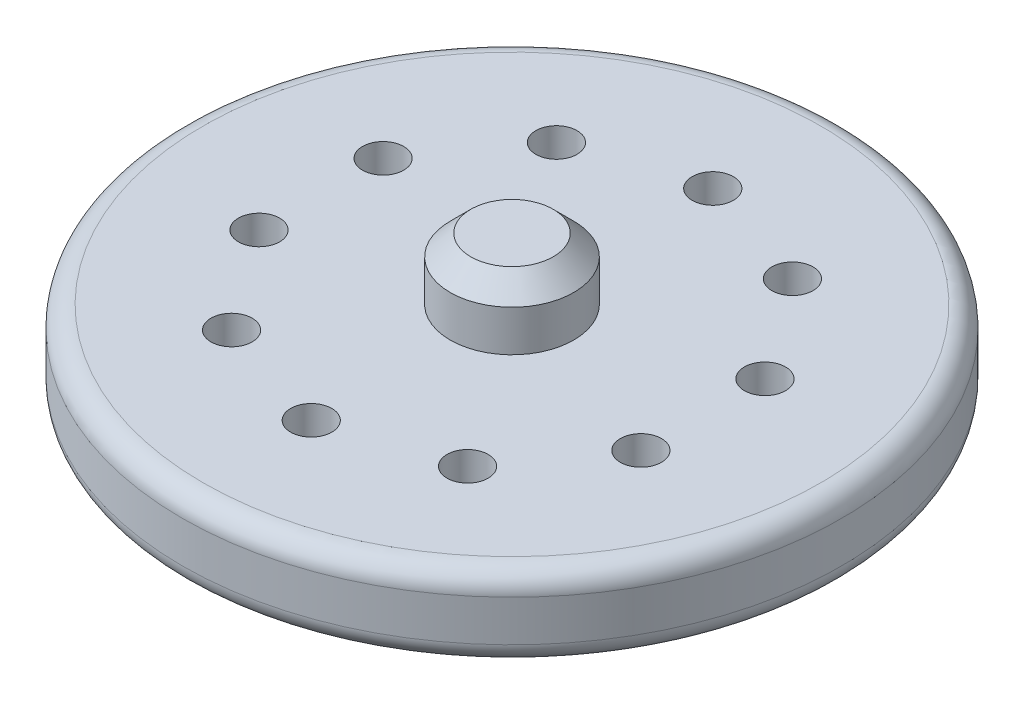
ISO-10303-21;
HEADER;
FILE_DESCRIPTION(('STEP AP214'),'2;1');
FILE_NAME('part.step','',(''),(''),'','','');
FILE_SCHEMA(('AUTOMOTIVE_DESIGN { 1 0 10303 214 1 1 1 1 }'));
ENDSEC;
DATA;
#1=APPLICATION_CONTEXT('core data for automotive mechanical design processes');
#2=APPLICATION_PROTOCOL_DEFINITION('international standard','automotive_design',2000,#1);
#3=PRODUCT_CONTEXT('',#1,'mechanical');
#4=PRODUCT('Part','Part','',(#3));
#5=PRODUCT_RELATED_PRODUCT_CATEGORY('part','',(#4));
#6=PRODUCT_DEFINITION_FORMATION('','',#4);
#7=PRODUCT_DEFINITION_CONTEXT('part definition',#1,'design');
#8=PRODUCT_DEFINITION('design','',#6,#7);
#9=PRODUCT_DEFINITION_SHAPE('','',#8);
#10=(LENGTH_UNIT() NAMED_UNIT(*) SI_UNIT(.MILLI.,.METRE.));
#11=(NAMED_UNIT(*) PLANE_ANGLE_UNIT() SI_UNIT($,.RADIAN.));
#12=(NAMED_UNIT(*) SI_UNIT($,.STERADIAN.) SOLID_ANGLE_UNIT());
#13=UNCERTAINTY_MEASURE_WITH_UNIT(LENGTH_MEASURE(1.E-05),#10,'distance_accuracy_value','');
#14=(GEOMETRIC_REPRESENTATION_CONTEXT(3) GLOBAL_UNCERTAINTY_ASSIGNED_CONTEXT((#13)) GLOBAL_UNIT_ASSIGNED_CONTEXT((#10,
#11,#12)) REPRESENTATION_CONTEXT('',''));
#15=CARTESIAN_POINT('',(0.,0.,0.));
#16=DIRECTION('',(0.,0.,1.));
#17=DIRECTION('',(1.,0.,0.));
#18=AXIS2_PLACEMENT_3D('',#15,#16,#17);
#19=CARTESIAN_POINT('',(-29.715512056726,20.,-28.3470345277978));
#20=DIRECTION('',(0.,-1.,0.));
#21=DIRECTION('',(0.,0.,-1.));
#22=AXIS2_PLACEMENT_3D('',#19,#20,#21);
#23=CYLINDRICAL_SURFACE('',#22,80.);
#24=CARTESIAN_POINT('',(-29.715512056726,5.,-28.3470345277978));
#25=DIRECTION('',(0.,1.,0.));
#26=DIRECTION('',(0.,0.,1.));
#27=AXIS2_PLACEMENT_3D('',#24,#25,#26);
#28=CIRCLE('',#27,80.);
#29=CARTESIAN_POINT('',(-29.715512056726,5.,51.6529654722022));
#30=VERTEX_POINT('',#29);
#31=EDGE_CURVE('E40',#30,#30,#28,.T.);
#32=ORIENTED_EDGE('',*,*,#31,.T.);
#33=EDGE_LOOP('',(#32));
#34=FACE_BOUND('',#33,.T.);
#35=CARTESIAN_POINT('',(-29.715512056726,15.,-28.3470345277978));
#36=DIRECTION('',(0.,1.,0.));
#37=DIRECTION('',(0.,0.,1.));
#38=AXIS2_PLACEMENT_3D('',#35,#36,#37);
#39=CIRCLE('',#38,80.);
#40=CARTESIAN_POINT('',(-29.715512056726,15.,51.6529654722022));
#41=VERTEX_POINT('',#40);
#42=EDGE_CURVE('E44',#41,#41,#39,.F.);
#43=ORIENTED_EDGE('',*,*,#42,.T.);
#44=EDGE_LOOP('',(#43));
#45=FACE_BOUND('',#44,.T.);
#46=ADVANCED_FACE('F33',(#34,#45),#23,.T.);
#47=CARTESIAN_POINT('',(-29.715512056726,20.,-28.3470345277978));
#48=DIRECTION('',(0.,1.,0.));
#49=DIRECTION('',(0.,0.,1.));
#50=AXIS2_PLACEMENT_3D('',#47,#48,#49);
#51=PLANE('',#50);
#52=CARTESIAN_POINT('',(-1.07025197123732,20.,-67.773852616659));
#53=DIRECTION('',(0.,1.,0.));
#54=DIRECTION('',(0.,0.,1.));
#55=AXIS2_PLACEMENT_3D('',#52,#53,#54);
#56=CIRCLE('',#55,5.);
#57=CARTESIAN_POINT('',(-1.07025197123732,20.,-62.773852616659));
#58=VERTEX_POINT('',#57);
#59=EDGE_CURVE('E112',#58,#58,#56,.T.);
#60=ORIENTED_EDGE('',*,*,#59,.F.);
#61=EDGE_LOOP('',(#60));
#62=FACE_BOUND('',#61,.T.);
#63=CARTESIAN_POINT('',(16.6334923781756,20.,-43.406738969484));
#64=DIRECTION('',(0.,1.,0.));
#65=DIRECTION('',(0.,0.,1.));
#66=AXIS2_PLACEMENT_3D('',#63,#64,#65);
#67=CIRCLE('',#66,5.);
#68=CARTESIAN_POINT('',(16.6334923781756,20.,-38.406738969484));
#69=VERTEX_POINT('',#68);
#70=EDGE_CURVE('E106',#69,#69,#67,.T.);
#71=ORIENTED_EDGE('',*,*,#70,.F.);
#72=EDGE_LOOP('',(#71));
#73=FACE_BOUND('',#72,.T.);
#74=CARTESIAN_POINT('',(16.6334923781759,20.,-13.2873300861126));
#75=DIRECTION('',(0.,1.,0.));
#76=DIRECTION('',(0.,0.,1.));
#77=AXIS2_PLACEMENT_3D('',#74,#75,#76);
#78=CIRCLE('',#77,5.);
#79=CARTESIAN_POINT('',(16.6334923781759,20.,-8.28733008611258));
#80=VERTEX_POINT('',#79);
#81=EDGE_CURVE('E100',#80,#80,#78,.T.);
#82=ORIENTED_EDGE('',*,*,#81,.F.);
#83=EDGE_LOOP('',(#82));
#84=FACE_BOUND('',#83,.T.);
#85=CARTESIAN_POINT('',(-1.0702519712365,20.,11.0797835610628));
#86=DIRECTION('',(0.,1.,0.));
#87=DIRECTION('',(0.,0.,1.));
#88=AXIS2_PLACEMENT_3D('',#85,#86,#87);
#89=CIRCLE('',#88,5.);
#90=CARTESIAN_POINT('',(-1.0702519712365,20.,16.0797835610628));
#91=VERTEX_POINT('',#90);
#92=EDGE_CURVE('E94',#91,#91,#89,.T.);
#93=ORIENTED_EDGE('',*,*,#92,.F.);
#94=EDGE_LOOP('',(#93));
#95=FACE_BOUND('',#94,.T.);
#96=CARTESIAN_POINT('',(-29.7155120567249,20.,20.3871927665525));
#97=DIRECTION('',(0.,1.,0.));
#98=DIRECTION('',(0.,0.,1.));
#99=AXIS2_PLACEMENT_3D('',#96,#97,#98);
#100=CIRCLE('',#99,5.00000000000001);
#101=CARTESIAN_POINT('',(-29.7155120567249,20.,25.3871927665525));
#102=VERTEX_POINT('',#101);
#103=EDGE_CURVE('E88',#102,#102,#100,.T.);
#104=ORIENTED_EDGE('',*,*,#103,.F.);
#105=EDGE_LOOP('',(#104));
#106=FACE_BOUND('',#105,.T.);
#107=CARTESIAN_POINT('',(-58.3607721422135,20.,11.0797835610632));
#108=DIRECTION('',(0.,1.,0.));
#109=DIRECTION('',(0.,0.,1.));
#110=AXIS2_PLACEMENT_3D('',#107,#108,#109);
#111=CIRCLE('',#110,5.00000000000001);
#112=CARTESIAN_POINT('',(-58.3607721422135,20.,16.0797835610632));
#113=VERTEX_POINT('',#112);
#114=EDGE_CURVE('E82',#113,#113,#111,.T.);
#115=ORIENTED_EDGE('',*,*,#114,.F.);
#116=EDGE_LOOP('',(#115));
#117=FACE_BOUND('',#116,.T.);
#118=CARTESIAN_POINT('',(-76.0645164916262,20.,-13.287330086112));
#119=DIRECTION('',(0.,1.,0.));
#120=DIRECTION('',(0.,0.,1.));
#121=AXIS2_PLACEMENT_3D('',#118,#119,#120);
#122=CIRCLE('',#121,5.);
#123=CARTESIAN_POINT('',(-76.0645164916262,20.,-8.28733008611195));
#124=VERTEX_POINT('',#123);
#125=EDGE_CURVE('E76',#124,#124,#122,.T.);
#126=ORIENTED_EDGE('',*,*,#125,.F.);
#127=EDGE_LOOP('',(#126));
#128=FACE_BOUND('',#127,.T.);
#129=CARTESIAN_POINT('',(-76.0645164916263,20.,-43.4067389694834));
#130=DIRECTION('',(0.,1.,0.));
#131=DIRECTION('',(0.,0.,1.));
#132=AXIS2_PLACEMENT_3D('',#129,#130,#131);
#133=CIRCLE('',#132,5.);
#134=CARTESIAN_POINT('',(-76.0645164916263,20.,-38.4067389694834));
#135=VERTEX_POINT('',#134);
#136=EDGE_CURVE('E69',#135,#135,#133,.T.);
#137=ORIENTED_EDGE('',*,*,#136,.F.);
#138=EDGE_LOOP('',(#137));
#139=FACE_BOUND('',#138,.T.);
#140=CARTESIAN_POINT('',(-58.3607721422138,20.,-67.7738526166586));
#141=DIRECTION('',(0.,1.,0.));
#142=DIRECTION('',(0.,0.,1.));
#143=AXIS2_PLACEMENT_3D('',#140,#141,#142);
#144=CIRCLE('',#143,5.);
#145=CARTESIAN_POINT('',(-58.3607721422138,20.,-62.7738526166586));
#146=VERTEX_POINT('',#145);
#147=EDGE_CURVE('E117',#146,#146,#144,.T.);
#148=ORIENTED_EDGE('',*,*,#147,.F.);
#149=EDGE_LOOP('',(#148));
#150=FACE_BOUND('',#149,.T.);
#151=CARTESIAN_POINT('',(-29.715512056726,20.,-77.0812618221482));
#152=DIRECTION('',(0.,1.,0.));
#153=DIRECTION('',(0.,0.,1.));
#154=AXIS2_PLACEMENT_3D('',#151,#152,#153);
#155=CIRCLE('',#154,5.);
#156=CARTESIAN_POINT('',(-29.715512056726,20.,-72.0812618221482));
#157=VERTEX_POINT('',#156);
#158=EDGE_CURVE('E63',#157,#157,#155,.T.);
#159=ORIENTED_EDGE('',*,*,#158,.F.);
#160=EDGE_LOOP('',(#159));
#161=FACE_BOUND('',#160,.T.);
#162=CARTESIAN_POINT('',(-29.715512056726,20.,-28.3470345277978));
#163=DIRECTION('',(0.,1.,0.));
#164=DIRECTION('',(0.,0.,1.));
#165=AXIS2_PLACEMENT_3D('',#162,#163,#164);
#166=CIRCLE('',#165,75.);
#167=CARTESIAN_POINT('',(-29.715512056726,20.,46.6529654722022));
#168=VERTEX_POINT('',#167);
#169=EDGE_CURVE('E48',#168,#168,#166,.T.);
#170=ORIENTED_EDGE('',*,*,#169,.T.);
#171=EDGE_LOOP('',(#170));
#172=FACE_BOUND('',#171,.T.);
#173=CARTESIAN_POINT('',(-29.715512056726,20.,-28.3470345277978));
#174=DIRECTION('',(0.,1.,0.));
#175=DIRECTION('',(0.,0.,1.));
#176=AXIS2_PLACEMENT_3D('',#173,#174,#175);
#177=CIRCLE('',#176,15.);
#178=CARTESIAN_POINT('',(-29.715512056726,20.,-13.3470345277978));
#179=VERTEX_POINT('',#178);
#180=EDGE_CURVE('E59',#179,#179,#177,.T.);
#181=ORIENTED_EDGE('',*,*,#180,.F.);
#182=EDGE_LOOP('',(#181));
#183=FACE_BOUND('',#182,.T.);
#184=ADVANCED_FACE('F134',(#62,#73,#84,#95,#106,#117,#128,#139,#150,#161,#172,#183),#51,.T.);
#185=CARTESIAN_POINT('',(-29.715512056726,0.,-28.3470345277978));
#186=DIRECTION('',(0.,1.,0.));
#187=DIRECTION('',(0.,0.,1.));
#188=AXIS2_PLACEMENT_3D('',#185,#186,#187);
#189=PLANE('',#188);
#190=CARTESIAN_POINT('',(-1.07025197123732,0.,-67.773852616659));
#191=DIRECTION('',(0.,1.,0.));
#192=DIRECTION('',(0.,0.,1.));
#193=AXIS2_PLACEMENT_3D('',#190,#191,#192);
#194=CIRCLE('',#193,5.);
#195=CARTESIAN_POINT('',(-1.07025197123732,0.,-62.773852616659));
#196=VERTEX_POINT('',#195);
#197=EDGE_CURVE('E66',#196,#196,#194,.T.);
#198=ORIENTED_EDGE('',*,*,#197,.T.);
#199=EDGE_LOOP('',(#198));
#200=FACE_BOUND('',#199,.T.);
#201=CARTESIAN_POINT('',(16.6334923781756,0.,-43.406738969484));
#202=DIRECTION('',(0.,1.,0.));
#203=DIRECTION('',(0.,0.,1.));
#204=AXIS2_PLACEMENT_3D('',#201,#202,#203);
#205=CIRCLE('',#204,5.);
#206=CARTESIAN_POINT('',(16.6334923781756,0.,-38.406738969484));
#207=VERTEX_POINT('',#206);
#208=EDGE_CURVE('E109',#207,#207,#205,.T.);
#209=ORIENTED_EDGE('',*,*,#208,.T.);
#210=EDGE_LOOP('',(#209));
#211=FACE_BOUND('',#210,.T.);
#212=CARTESIAN_POINT('',(16.6334923781759,0.,-13.2873300861126));
#213=DIRECTION('',(0.,1.,0.));
#214=DIRECTION('',(0.,0.,1.));
#215=AXIS2_PLACEMENT_3D('',#212,#213,#214);
#216=CIRCLE('',#215,5.);
#217=CARTESIAN_POINT('',(16.6334923781759,0.,-8.28733008611258));
#218=VERTEX_POINT('',#217);
#219=EDGE_CURVE('E103',#218,#218,#216,.T.);
#220=ORIENTED_EDGE('',*,*,#219,.T.);
#221=EDGE_LOOP('',(#220));
#222=FACE_BOUND('',#221,.T.);
#223=CARTESIAN_POINT('',(-1.0702519712365,0.,11.0797835610628));
#224=DIRECTION('',(0.,1.,0.));
#225=DIRECTION('',(0.,0.,1.));
#226=AXIS2_PLACEMENT_3D('',#223,#224,#225);
#227=CIRCLE('',#226,5.);
#228=CARTESIAN_POINT('',(-1.0702519712365,0.,16.0797835610628));
#229=VERTEX_POINT('',#228);
#230=EDGE_CURVE('E97',#229,#229,#227,.T.);
#231=ORIENTED_EDGE('',*,*,#230,.T.);
#232=EDGE_LOOP('',(#231));
#233=FACE_BOUND('',#232,.T.);
#234=CARTESIAN_POINT('',(-29.7155120567249,0.,20.3871927665525));
#235=DIRECTION('',(0.,1.,0.));
#236=DIRECTION('',(0.,0.,1.));
#237=AXIS2_PLACEMENT_3D('',#234,#235,#236);
#238=CIRCLE('',#237,5.00000000000001);
#239=CARTESIAN_POINT('',(-29.7155120567249,0.,25.3871927665525));
#240=VERTEX_POINT('',#239);
#241=EDGE_CURVE('E91',#240,#240,#238,.T.);
#242=ORIENTED_EDGE('',*,*,#241,.T.);
#243=EDGE_LOOP('',(#242));
#244=FACE_BOUND('',#243,.T.);
#245=CARTESIAN_POINT('',(-58.3607721422135,0.,11.0797835610632));
#246=DIRECTION('',(0.,1.,0.));
#247=DIRECTION('',(0.,0.,1.));
#248=AXIS2_PLACEMENT_3D('',#245,#246,#247);
#249=CIRCLE('',#248,5.00000000000001);
#250=CARTESIAN_POINT('',(-58.3607721422135,0.,16.0797835610632));
#251=VERTEX_POINT('',#250);
#252=EDGE_CURVE('E85',#251,#251,#249,.T.);
#253=ORIENTED_EDGE('',*,*,#252,.T.);
#254=EDGE_LOOP('',(#253));
#255=FACE_BOUND('',#254,.T.);
#256=CARTESIAN_POINT('',(-76.0645164916262,0.,-13.287330086112));
#257=DIRECTION('',(0.,1.,0.));
#258=DIRECTION('',(0.,0.,1.));
#259=AXIS2_PLACEMENT_3D('',#256,#257,#258);
#260=CIRCLE('',#259,5.);
#261=CARTESIAN_POINT('',(-76.0645164916262,0.,-8.28733008611195));
#262=VERTEX_POINT('',#261);
#263=EDGE_CURVE('E79',#262,#262,#260,.T.);
#264=ORIENTED_EDGE('',*,*,#263,.T.);
#265=EDGE_LOOP('',(#264));
#266=FACE_BOUND('',#265,.T.);
#267=CARTESIAN_POINT('',(-76.0645164916263,0.,-43.4067389694834));
#268=DIRECTION('',(0.,1.,0.));
#269=DIRECTION('',(0.,0.,1.));
#270=AXIS2_PLACEMENT_3D('',#267,#268,#269);
#271=CIRCLE('',#270,5.);
#272=CARTESIAN_POINT('',(-76.0645164916263,0.,-38.4067389694834));
#273=VERTEX_POINT('',#272);
#274=EDGE_CURVE('E72',#273,#273,#271,.T.);
#275=ORIENTED_EDGE('',*,*,#274,.T.);
#276=EDGE_LOOP('',(#275));
#277=FACE_BOUND('',#276,.T.);
#278=CARTESIAN_POINT('',(-58.3607721422138,0.,-67.7738526166586));
#279=DIRECTION('',(0.,1.,0.));
#280=DIRECTION('',(0.,0.,1.));
#281=AXIS2_PLACEMENT_3D('',#278,#279,#280);
#282=CIRCLE('',#281,5.);
#283=CARTESIAN_POINT('',(-58.3607721422138,0.,-62.7738526166586));
#284=VERTEX_POINT('',#283);
#285=EDGE_CURVE('E73',#284,#284,#282,.T.);
#286=ORIENTED_EDGE('',*,*,#285,.T.);
#287=EDGE_LOOP('',(#286));
#288=FACE_BOUND('',#287,.T.);
#289=CARTESIAN_POINT('',(-29.715512056726,0.,-77.0812618221482));
#290=DIRECTION('',(0.,1.,0.));
#291=DIRECTION('',(0.,0.,1.));
#292=AXIS2_PLACEMENT_3D('',#289,#290,#291);
#293=CIRCLE('',#292,5.);
#294=CARTESIAN_POINT('',(-29.715512056726,0.,-72.0812618221482));
#295=VERTEX_POINT('',#294);
#296=EDGE_CURVE('E62',#295,#295,#293,.T.);
#297=ORIENTED_EDGE('',*,*,#296,.T.);
#298=EDGE_LOOP('',(#297));
#299=FACE_BOUND('',#298,.T.);
#300=CARTESIAN_POINT('',(-29.715512056726,0.,-28.3470345277978));
#301=DIRECTION('',(0.,1.,0.));
#302=DIRECTION('',(0.,0.,1.));
#303=AXIS2_PLACEMENT_3D('',#300,#301,#302);
#304=CIRCLE('',#303,75.);
#305=CARTESIAN_POINT('',(-29.715512056726,0.,46.6529654722022));
#306=VERTEX_POINT('',#305);
#307=EDGE_CURVE('E10',#306,#306,#304,.F.);
#308=ORIENTED_EDGE('',*,*,#307,.T.);
#309=EDGE_LOOP('',(#308));
#310=FACE_BOUND('',#309,.T.);
#311=ADVANCED_FACE('F123',(#200,#211,#222,#233,#244,#255,#266,#277,#288,#299,#310),#189,.F.);
#312=CARTESIAN_POINT('',(-29.715512056726,35.,-28.3470345277978));
#313=DIRECTION('',(0.,-1.,0.));
#314=DIRECTION('',(0.,0.,-1.));
#315=AXIS2_PLACEMENT_3D('',#312,#313,#314);
#316=CYLINDRICAL_SURFACE('',#315,15.);
#317=CARTESIAN_POINT('',(-29.715512056726,30.,-28.3470345277978));
#318=DIRECTION('',(0.,1.,0.));
#319=DIRECTION('',(0.,0.,1.));
#320=AXIS2_PLACEMENT_3D('',#317,#318,#319);
#321=CIRCLE('',#320,15.);
#322=CARTESIAN_POINT('',(-29.715512056726,30.,-13.3470345277978));
#323=VERTEX_POINT('',#322);
#324=EDGE_CURVE('E53',#323,#323,#321,.F.);
#325=ORIENTED_EDGE('',*,*,#324,.T.);
#326=EDGE_LOOP('',(#325));
#327=FACE_BOUND('',#326,.T.);
#328=ORIENTED_EDGE('',*,*,#180,.T.);
#329=EDGE_LOOP('',(#328));
#330=FACE_BOUND('',#329,.T.);
#331=ADVANCED_FACE('F145',(#327,#330),#316,.T.);
#332=CARTESIAN_POINT('',(-29.715512056726,35.,-28.3470345277978));
#333=DIRECTION('',(0.,1.,0.));
#334=DIRECTION('',(0.,0.,1.));
#335=AXIS2_PLACEMENT_3D('',#332,#333,#334);
#336=PLANE('',#335);
#337=CARTESIAN_POINT('',(-29.715512056726,35.,-28.3470345277978));
#338=DIRECTION('',(0.,1.,0.));
#339=DIRECTION('',(0.,0.,1.));
#340=AXIS2_PLACEMENT_3D('',#337,#338,#339);
#341=CIRCLE('',#340,10.);
#342=CARTESIAN_POINT('',(-29.715512056726,35.,-18.3470345277978));
#343=VERTEX_POINT('',#342);
#344=EDGE_CURVE('E56',#343,#343,#341,.T.);
#345=ORIENTED_EDGE('',*,*,#344,.T.);
#346=EDGE_LOOP('',(#345));
#347=FACE_BOUND('',#346,.T.);
#348=ADVANCED_FACE('F147',(#347),#336,.T.);
#349=CARTESIAN_POINT('',(-29.715512056726,35.,-28.3470345277978));
#350=DIRECTION('',(0.,-1.,0.));
#351=DIRECTION('',(0.,0.,-1.));
#352=AXIS2_PLACEMENT_3D('',#349,#350,#351);
#353=CONICAL_SURFACE('',#352,10.,0.785398163397446);
#354=ORIENTED_EDGE('',*,*,#324,.F.);
#355=EDGE_LOOP('',(#354));
#356=FACE_BOUND('',#355,.T.);
#357=ORIENTED_EDGE('',*,*,#344,.F.);
#358=EDGE_LOOP('',(#357));
#359=FACE_BOUND('',#358,.T.);
#360=ADVANCED_FACE('F154',(#356,#359),#353,.T.);
#361=CARTESIAN_POINT('',(-29.715512056726,15.,-28.3470345277978));
#362=DIRECTION('',(0.,1.,0.));
#363=DIRECTION('',(0.,0.,1.));
#364=AXIS2_PLACEMENT_3D('',#361,#362,#363);
#365=TOROIDAL_SURFACE('',#364,75.,5.);
#366=ORIENTED_EDGE('',*,*,#42,.F.);
#367=EDGE_LOOP('',(#366));
#368=FACE_BOUND('',#367,.T.);
#369=ORIENTED_EDGE('',*,*,#169,.F.);
#370=EDGE_LOOP('',(#369));
#371=FACE_BOUND('',#370,.T.);
#372=ADVANCED_FACE('F169',(#368,#371),#365,.T.);
#373=CARTESIAN_POINT('',(-29.715512056726,5.,-28.3470345277978));
#374=DIRECTION('',(0.,1.,0.));
#375=DIRECTION('',(0.,0.,1.));
#376=AXIS2_PLACEMENT_3D('',#373,#374,#375);
#377=TOROIDAL_SURFACE('',#376,75.,5.);
#378=ORIENTED_EDGE('',*,*,#307,.F.);
#379=EDGE_LOOP('',(#378));
#380=FACE_BOUND('',#379,.T.);
#381=ORIENTED_EDGE('',*,*,#31,.F.);
#382=EDGE_LOOP('',(#381));
#383=FACE_BOUND('',#382,.T.);
#384=ADVANCED_FACE('F35',(#380,#383),#377,.T.);
#385=CARTESIAN_POINT('',(-29.715512056726,0.,-77.0812618221482));
#386=DIRECTION('',(0.,1.,0.));
#387=DIRECTION('',(0.,0.,1.));
#388=AXIS2_PLACEMENT_3D('',#385,#386,#387);
#389=CYLINDRICAL_SURFACE('',#388,5.);
#390=ORIENTED_EDGE('',*,*,#296,.F.);
#391=EDGE_LOOP('',(#390));
#392=FACE_BOUND('',#391,.T.);
#393=ORIENTED_EDGE('',*,*,#158,.T.);
#394=EDGE_LOOP('',(#393));
#395=FACE_BOUND('',#394,.T.);
#396=ADVANCED_FACE('F130',(#392,#395),#389,.F.);
#397=CARTESIAN_POINT('',(-58.3607721422138,0.,-67.7738526166586));
#398=DIRECTION('',(0.,1.,0.));
#399=DIRECTION('',(0.,0.,1.));
#400=AXIS2_PLACEMENT_3D('',#397,#398,#399);
#401=CYLINDRICAL_SURFACE('',#400,5.);
#402=ORIENTED_EDGE('',*,*,#285,.F.);
#403=EDGE_LOOP('',(#402));
#404=FACE_BOUND('',#403,.T.);
#405=ORIENTED_EDGE('',*,*,#147,.T.);
#406=EDGE_LOOP('',(#405));
#407=FACE_BOUND('',#406,.T.);
#408=ADVANCED_FACE('F126',(#404,#407),#401,.F.);
#409=CARTESIAN_POINT('',(-76.0645164916263,0.,-43.4067389694834));
#410=DIRECTION('',(0.,1.,0.));
#411=DIRECTION('',(0.,0.,1.));
#412=AXIS2_PLACEMENT_3D('',#409,#410,#411);
#413=CYLINDRICAL_SURFACE('',#412,5.);
#414=ORIENTED_EDGE('',*,*,#274,.F.);
#415=EDGE_LOOP('',(#414));
#416=FACE_BOUND('',#415,.T.);
#417=ORIENTED_EDGE('',*,*,#136,.T.);
#418=EDGE_LOOP('',(#417));
#419=FACE_BOUND('',#418,.T.);
#420=ADVANCED_FACE('F129',(#416,#419),#413,.F.);
#421=CARTESIAN_POINT('',(-76.0645164916262,0.,-13.287330086112));
#422=DIRECTION('',(0.,1.,0.));
#423=DIRECTION('',(0.,0.,1.));
#424=AXIS2_PLACEMENT_3D('',#421,#422,#423);
#425=CYLINDRICAL_SURFACE('',#424,5.);
#426=ORIENTED_EDGE('',*,*,#263,.F.);
#427=EDGE_LOOP('',(#426));
#428=FACE_BOUND('',#427,.T.);
#429=ORIENTED_EDGE('',*,*,#125,.T.);
#430=EDGE_LOOP('',(#429));
#431=FACE_BOUND('',#430,.T.);
#432=ADVANCED_FACE('F192',(#428,#431),#425,.F.);
#433=CARTESIAN_POINT('',(-58.3607721422135,0.,11.0797835610632));
#434=DIRECTION('',(0.,1.,0.));
#435=DIRECTION('',(0.,0.,1.));
#436=AXIS2_PLACEMENT_3D('',#433,#434,#435);
#437=CYLINDRICAL_SURFACE('',#436,5.00000000000001);
#438=ORIENTED_EDGE('',*,*,#252,.F.);
#439=EDGE_LOOP('',(#438));
#440=FACE_BOUND('',#439,.T.);
#441=ORIENTED_EDGE('',*,*,#114,.T.);
#442=EDGE_LOOP('',(#441));
#443=FACE_BOUND('',#442,.T.);
#444=ADVANCED_FACE('F196',(#440,#443),#437,.F.);
#445=CARTESIAN_POINT('',(-29.7155120567249,0.,20.3871927665525));
#446=DIRECTION('',(0.,1.,0.));
#447=DIRECTION('',(0.,0.,1.));
#448=AXIS2_PLACEMENT_3D('',#445,#446,#447);
#449=CYLINDRICAL_SURFACE('',#448,5.00000000000001);
#450=ORIENTED_EDGE('',*,*,#241,.F.);
#451=EDGE_LOOP('',(#450));
#452=FACE_BOUND('',#451,.T.);
#453=ORIENTED_EDGE('',*,*,#103,.T.);
#454=EDGE_LOOP('',(#453));
#455=FACE_BOUND('',#454,.T.);
#456=ADVANCED_FACE('F200',(#452,#455),#449,.F.);
#457=CARTESIAN_POINT('',(-1.0702519712365,0.,11.0797835610628));
#458=DIRECTION('',(0.,1.,0.));
#459=DIRECTION('',(0.,0.,1.));
#460=AXIS2_PLACEMENT_3D('',#457,#458,#459);
#461=CYLINDRICAL_SURFACE('',#460,5.);
#462=ORIENTED_EDGE('',*,*,#230,.F.);
#463=EDGE_LOOP('',(#462));
#464=FACE_BOUND('',#463,.T.);
#465=ORIENTED_EDGE('',*,*,#92,.T.);
#466=EDGE_LOOP('',(#465));
#467=FACE_BOUND('',#466,.T.);
#468=ADVANCED_FACE('F204',(#464,#467),#461,.F.);
#469=CARTESIAN_POINT('',(16.6334923781759,0.,-13.2873300861126));
#470=DIRECTION('',(0.,1.,0.));
#471=DIRECTION('',(0.,0.,1.));
#472=AXIS2_PLACEMENT_3D('',#469,#470,#471);
#473=CYLINDRICAL_SURFACE('',#472,5.);
#474=ORIENTED_EDGE('',*,*,#219,.F.);
#475=EDGE_LOOP('',(#474));
#476=FACE_BOUND('',#475,.T.);
#477=ORIENTED_EDGE('',*,*,#81,.T.);
#478=EDGE_LOOP('',(#477));
#479=FACE_BOUND('',#478,.T.);
#480=ADVANCED_FACE('F208',(#476,#479),#473,.F.);
#481=CARTESIAN_POINT('',(16.6334923781756,0.,-43.406738969484));
#482=DIRECTION('',(0.,1.,0.));
#483=DIRECTION('',(0.,0.,1.));
#484=AXIS2_PLACEMENT_3D('',#481,#482,#483);
#485=CYLINDRICAL_SURFACE('',#484,5.);
#486=ORIENTED_EDGE('',*,*,#208,.F.);
#487=EDGE_LOOP('',(#486));
#488=FACE_BOUND('',#487,.T.);
#489=ORIENTED_EDGE('',*,*,#70,.T.);
#490=EDGE_LOOP('',(#489));
#491=FACE_BOUND('',#490,.T.);
#492=ADVANCED_FACE('F212',(#488,#491),#485,.F.);
#493=CARTESIAN_POINT('',(-1.07025197123732,0.,-67.773852616659));
#494=DIRECTION('',(0.,1.,0.));
#495=DIRECTION('',(0.,0.,1.));
#496=AXIS2_PLACEMENT_3D('',#493,#494,#495);
#497=CYLINDRICAL_SURFACE('',#496,5.);
#498=ORIENTED_EDGE('',*,*,#197,.F.);
#499=EDGE_LOOP('',(#498));
#500=FACE_BOUND('',#499,.T.);
#501=ORIENTED_EDGE('',*,*,#59,.T.);
#502=EDGE_LOOP('',(#501));
#503=FACE_BOUND('',#502,.T.);
#504=ADVANCED_FACE('F216',(#500,#503),#497,.F.);
#505=CLOSED_SHELL('',(#46,#184,#311,#331,#348,#360,#372,#384,#396,#408,#420,#432,#444,#456,#468,
#480,#492,#504));
#506=MANIFOLD_SOLID_BREP('B2',#505);
#507=ADVANCED_BREP_SHAPE_REPRESENTATION('',(#18,#506),#14);
#508=SHAPE_DEFINITION_REPRESENTATION(#9,#507);
ENDSEC;
END-ISO-10303-21;
